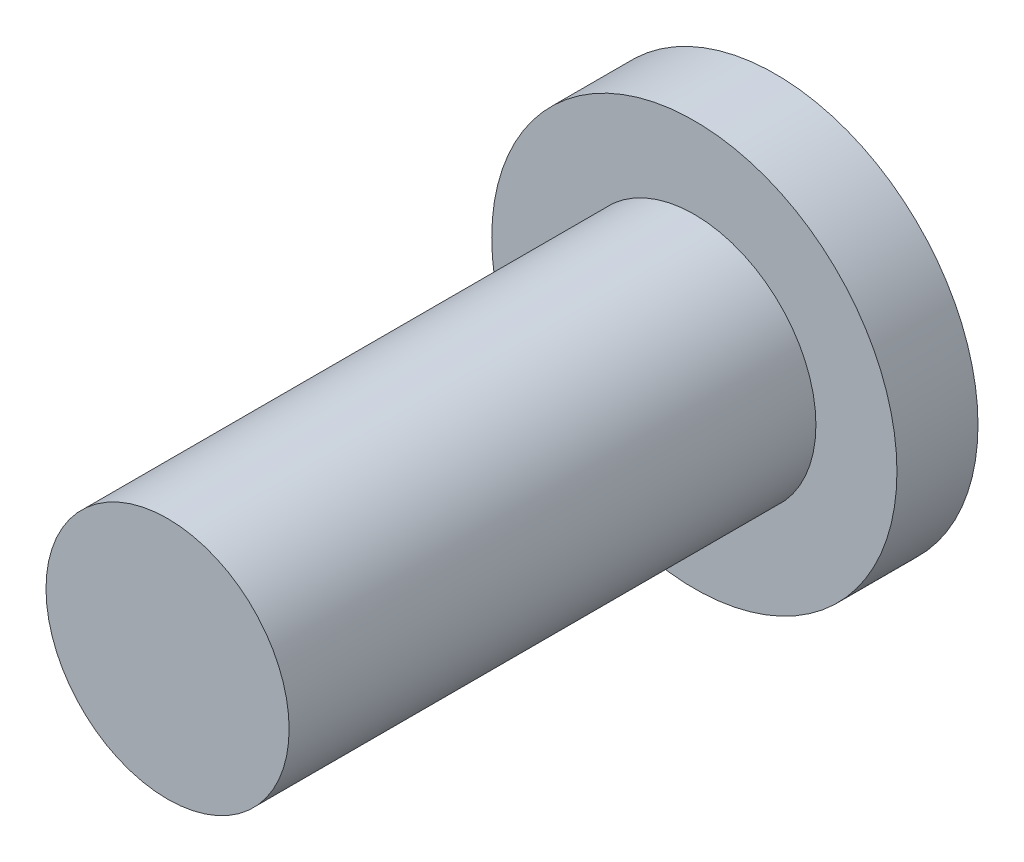
ISO-10303-21;
HEADER;
FILE_DESCRIPTION(('STEP AP214'),'2;1');
FILE_NAME('part.step','',(''),(''),'','','');
FILE_SCHEMA(('AUTOMOTIVE_DESIGN { 1 0 10303 214 1 1 1 1 }'));
ENDSEC;
DATA;
#1=APPLICATION_CONTEXT('core data for automotive mechanical design processes');
#2=APPLICATION_PROTOCOL_DEFINITION('international standard','automotive_design',2000,#1);
#3=PRODUCT_CONTEXT('',#1,'mechanical');
#4=PRODUCT('Part','Part','',(#3));
#5=PRODUCT_RELATED_PRODUCT_CATEGORY('part','',(#4));
#6=PRODUCT_DEFINITION_FORMATION('','',#4);
#7=PRODUCT_DEFINITION_CONTEXT('part definition',#1,'design');
#8=PRODUCT_DEFINITION('design','',#6,#7);
#9=PRODUCT_DEFINITION_SHAPE('','',#8);
#10=(LENGTH_UNIT() NAMED_UNIT(*) SI_UNIT(.MILLI.,.METRE.));
#11=(NAMED_UNIT(*) PLANE_ANGLE_UNIT() SI_UNIT($,.RADIAN.));
#12=(NAMED_UNIT(*) SI_UNIT($,.STERADIAN.) SOLID_ANGLE_UNIT());
#13=UNCERTAINTY_MEASURE_WITH_UNIT(LENGTH_MEASURE(1.E-05),#10,'distance_accuracy_value','');
#14=(GEOMETRIC_REPRESENTATION_CONTEXT(3) GLOBAL_UNCERTAINTY_ASSIGNED_CONTEXT((#13)) GLOBAL_UNIT_ASSIGNED_CONTEXT((#10,
#11,#12)) REPRESENTATION_CONTEXT('',''));
#15=CARTESIAN_POINT('',(0.,0.,0.));
#16=DIRECTION('',(0.,0.,1.));
#17=DIRECTION('',(1.,0.,0.));
#18=AXIS2_PLACEMENT_3D('',#15,#16,#17);
#19=CARTESIAN_POINT('',(0.,0.,13.));
#20=DIRECTION('',(0.,0.,-1.));
#21=DIRECTION('',(-1.,0.,0.));
#22=AXIS2_PLACEMENT_3D('',#19,#20,#21);
#23=CYLINDRICAL_SURFACE('',#22,3.);
#24=CARTESIAN_POINT('',(0.,0.,13.));
#25=DIRECTION('',(0.,0.,1.));
#26=DIRECTION('',(1.,0.,0.));
#27=AXIS2_PLACEMENT_3D('',#24,#25,#26);
#28=CIRCLE('',#27,3.);
#29=CARTESIAN_POINT('',(-3.,0.,13.));
#30=VERTEX_POINT('',#29);
#31=EDGE_CURVE('E10',#30,#30,#28,.T.);
#32=CARTESIAN_POINT('',(0.,0.,0.));
#33=DIRECTION('',(0.,0.,1.));
#34=DIRECTION('',(1.,0.,0.));
#35=AXIS2_PLACEMENT_3D('',#32,#33,#34);
#36=CIRCLE('',#35,3.);
#37=CARTESIAN_POINT('',(-3.,0.,0.));
#38=VERTEX_POINT('',#37);
#39=EDGE_CURVE('E46',#38,#38,#36,.T.);
#40=CARTESIAN_POINT('',(-3.,0.,13.));
#41=CARTESIAN_POINT('',(-3.,0.,12.8645833333333));
#42=CARTESIAN_POINT('',(-3.,0.,12.7291666666667));
#43=CARTESIAN_POINT('',(-3.,0.,12.4583333333333));
#44=CARTESIAN_POINT('',(-3.,0.,12.3229166666667));
#45=CARTESIAN_POINT('',(-3.,0.,12.0520833333333));
#46=CARTESIAN_POINT('',(-3.,0.,11.9166666666667));
#47=CARTESIAN_POINT('',(-3.,0.,11.6458333333333));
#48=CARTESIAN_POINT('',(-3.,0.,11.5104166666667));
#49=CARTESIAN_POINT('',(-3.,0.,11.2395833333333));
#50=CARTESIAN_POINT('',(-3.,0.,11.1041666666667));
#51=CARTESIAN_POINT('',(-3.,0.,10.8333333333333));
#52=CARTESIAN_POINT('',(-3.,0.,10.6979166666667));
#53=CARTESIAN_POINT('',(-3.,0.,10.4270833333333));
#54=CARTESIAN_POINT('',(-3.,0.,10.2916666666667));
#55=CARTESIAN_POINT('',(-3.,0.,10.0208333333333));
#56=CARTESIAN_POINT('',(-3.,0.,9.88541666666667));
#57=CARTESIAN_POINT('',(-3.,0.,9.61458333333333));
#58=CARTESIAN_POINT('',(-3.,0.,9.47916666666667));
#59=CARTESIAN_POINT('',(-3.,0.,9.20833333333333));
#60=CARTESIAN_POINT('',(-3.,0.,9.07291666666667));
#61=CARTESIAN_POINT('',(-3.,0.,8.80208333333333));
#62=CARTESIAN_POINT('',(-3.,0.,8.66666666666667));
#63=CARTESIAN_POINT('',(-3.,0.,8.39583333333333));
#64=CARTESIAN_POINT('',(-3.,0.,8.26041666666667));
#65=CARTESIAN_POINT('',(-3.,0.,7.98958333333333));
#66=CARTESIAN_POINT('',(-3.,0.,7.85416666666667));
#67=CARTESIAN_POINT('',(-3.,0.,7.58333333333333));
#68=CARTESIAN_POINT('',(-3.,0.,7.44791666666667));
#69=CARTESIAN_POINT('',(-3.,0.,7.17708333333333));
#70=CARTESIAN_POINT('',(-3.,0.,7.04166666666667));
#71=CARTESIAN_POINT('',(-3.,0.,6.77083333333333));
#72=CARTESIAN_POINT('',(-3.,0.,6.63541666666667));
#73=CARTESIAN_POINT('',(-3.,0.,6.36458333333333));
#74=CARTESIAN_POINT('',(-3.,0.,6.22916666666667));
#75=CARTESIAN_POINT('',(-3.,0.,5.95833333333333));
#76=CARTESIAN_POINT('',(-3.,0.,5.82291666666667));
#77=CARTESIAN_POINT('',(-3.,0.,5.55208333333333));
#78=CARTESIAN_POINT('',(-3.,0.,5.41666666666667));
#79=CARTESIAN_POINT('',(-3.,0.,5.14583333333333));
#80=CARTESIAN_POINT('',(-3.,0.,5.01041666666667));
#81=CARTESIAN_POINT('',(-3.,0.,4.73958333333333));
#82=CARTESIAN_POINT('',(-3.,0.,4.60416666666667));
#83=CARTESIAN_POINT('',(-3.,0.,4.33333333333333));
#84=CARTESIAN_POINT('',(-3.,0.,4.19791666666667));
#85=CARTESIAN_POINT('',(-3.,0.,3.92708333333333));
#86=CARTESIAN_POINT('',(-3.,0.,3.79166666666667));
#87=CARTESIAN_POINT('',(-3.,0.,3.52083333333333));
#88=CARTESIAN_POINT('',(-3.,0.,3.38541666666667));
#89=CARTESIAN_POINT('',(-3.,0.,3.11458333333333));
#90=CARTESIAN_POINT('',(-3.,0.,2.97916666666667));
#91=CARTESIAN_POINT('',(-3.,0.,2.70833333333333));
#92=CARTESIAN_POINT('',(-3.,0.,2.57291666666667));
#93=CARTESIAN_POINT('',(-3.,0.,2.30208333333333));
#94=CARTESIAN_POINT('',(-3.,0.,2.16666666666667));
#95=CARTESIAN_POINT('',(-3.,0.,1.89583333333333));
#96=CARTESIAN_POINT('',(-3.,0.,1.76041666666667));
#97=CARTESIAN_POINT('',(-3.,0.,1.48958333333333));
#98=CARTESIAN_POINT('',(-3.,0.,1.35416666666667));
#99=CARTESIAN_POINT('',(-3.,0.,1.08333333333333));
#100=CARTESIAN_POINT('',(-3.,0.,0.947916666666667));
#101=CARTESIAN_POINT('',(-3.,0.,0.677083333333334));
#102=CARTESIAN_POINT('',(-3.,0.,0.541666666666667));
#103=CARTESIAN_POINT('',(-3.,0.,0.270833333333334));
#104=CARTESIAN_POINT('',(-3.,0.,0.135416666666667));
#105=CARTESIAN_POINT('',(-3.,0.,0.));
#106=B_SPLINE_CURVE_WITH_KNOTS('',3,(#40,#41,#42,#43,#44,#45,#46,#47,#48,#49,#50,#51,#52,#53,
#54,#55,#56,#57,#58,#59,#60,#61,#62,#63,#64,#65,#66,#67,#68,#69,#70,#71,#72,#73,#74,#75,#76,#77,
#78,#79,#80,#81,#82,#83,#84,#85,#86,#87,#88,#89,#90,#91,#92,#93,#94,#95,#96,#97,#98,#99,#100,
#101,#102,#103,#104,#105),.UNSPECIFIED.,.F.,.F.,(4,2,2,2,2,2,2,2,2,2,2,2,2,2,2,2,2,2,2,2,2,2,2,
2,2,2,2,2,2,2,2,2,4),(0.,0.406249999999999,0.812499999999999,1.21875,1.625,2.03125,2.4375,
2.84375,3.25,3.65625,4.0625,4.46875,4.875,5.28125,5.6875,6.09375,6.5,6.90625,7.3125,7.71875,
8.125,8.53125,8.9375,9.34375,9.75,10.15625,10.5625,10.96875,11.375,11.78125,12.1875,12.59375,
13.),.UNSPECIFIED.);
#107=EDGE_CURVE('BSEAM43',#30,#38,#106,.T.);
#108=ORIENTED_EDGE('',*,*,#31,.F.);
#109=ORIENTED_EDGE('',*,*,#39,.T.);
#110=ORIENTED_EDGE('',*,*,#107,.T.);
#111=ORIENTED_EDGE('',*,*,#107,.F.);
#112=EDGE_LOOP('',(#108,#110,#109,#111));
#113=FACE_BOUND('',#112,.T.);
#114=ADVANCED_FACE('F43',(#113),#23,.T.);
#115=CARTESIAN_POINT('',(0.,0.,13.));
#116=DIRECTION('',(0.,0.,1.));
#117=DIRECTION('',(1.,0.,0.));
#118=AXIS2_PLACEMENT_3D('',#115,#116,#117);
#119=PLANE('',#118);
#120=ORIENTED_EDGE('',*,*,#31,.T.);
#121=EDGE_LOOP('',(#120));
#122=FACE_BOUND('',#121,.T.);
#123=ADVANCED_FACE('F66',(#122),#119,.T.);
#124=CARTESIAN_POINT('',(0.,0.,-2.));
#125=DIRECTION('',(0.,0.,1.));
#126=DIRECTION('',(1.,0.,0.));
#127=AXIS2_PLACEMENT_3D('',#124,#125,#126);
#128=CYLINDRICAL_SURFACE('',#127,5.);
#129=CARTESIAN_POINT('',(0.,0.,-2.));
#130=DIRECTION('',(0.,0.,-1.));
#131=DIRECTION('',(-1.,0.,0.));
#132=AXIS2_PLACEMENT_3D('',#129,#130,#131);
#133=CIRCLE('',#132,5.);
#134=CARTESIAN_POINT('',(-5.,0.,-2.));
#135=VERTEX_POINT('',#134);
#136=EDGE_CURVE('E54',#135,#135,#133,.T.);
#137=ORIENTED_EDGE('',*,*,#136,.F.);
#138=EDGE_LOOP('',(#137));
#139=FACE_BOUND('',#138,.T.);
#140=CARTESIAN_POINT('',(0.,0.,0.));
#141=DIRECTION('',(0.,0.,-1.));
#142=DIRECTION('',(-1.,0.,0.));
#143=AXIS2_PLACEMENT_3D('',#140,#141,#142);
#144=CIRCLE('',#143,5.);
#145=CARTESIAN_POINT('',(-5.,0.,0.));
#146=VERTEX_POINT('',#145);
#147=EDGE_CURVE('E60',#146,#146,#144,.T.);
#148=ORIENTED_EDGE('',*,*,#147,.T.);
#149=EDGE_LOOP('',(#148));
#150=FACE_BOUND('',#149,.T.);
#151=ADVANCED_FACE('F69',(#139,#150),#128,.T.);
#152=CARTESIAN_POINT('',(0.,0.,-2.));
#153=DIRECTION('',(0.,0.,-1.));
#154=DIRECTION('',(-1.,0.,0.));
#155=AXIS2_PLACEMENT_3D('',#152,#153,#154);
#156=PLANE('',#155);
#157=ORIENTED_EDGE('',*,*,#136,.T.);
#158=EDGE_LOOP('',(#157));
#159=FACE_BOUND('',#158,.T.);
#160=ADVANCED_FACE('F63',(#159),#156,.T.);
#161=CARTESIAN_POINT('',(0.,0.,0.));
#162=DIRECTION('',(0.,0.,-1.));
#163=DIRECTION('',(-1.,0.,0.));
#164=AXIS2_PLACEMENT_3D('',#161,#162,#163);
#165=PLANE('',#164);
#166=ORIENTED_EDGE('',*,*,#39,.F.);
#167=EDGE_LOOP('',(#166));
#168=FACE_BOUND('',#167,.T.);
#169=ORIENTED_EDGE('',*,*,#147,.F.);
#170=EDGE_LOOP('',(#169));
#171=FACE_BOUND('',#170,.T.);
#172=ADVANCED_FACE('F74',(#168,#171),#165,.F.);
#173=CLOSED_SHELL('',(#114,#123,#151,#160,#172));
#174=MANIFOLD_SOLID_BREP('B2',#173);
#175=ADVANCED_BREP_SHAPE_REPRESENTATION('',(#18,#174),#14);
#176=SHAPE_DEFINITION_REPRESENTATION(#9,#175);
ENDSEC;
END-ISO-10303-21;
